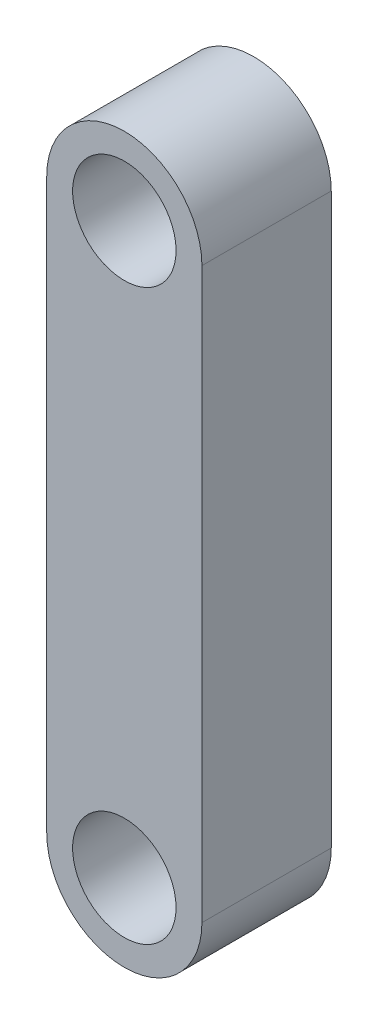
ISO-10303-21;
HEADER;
FILE_DESCRIPTION(('STEP AP214'),'2;1');
FILE_NAME('part.step','',(''),(''),'','','');
FILE_SCHEMA(('AUTOMOTIVE_DESIGN { 1 0 10303 214 1 1 1 1 }'));
ENDSEC;
DATA;
#1=APPLICATION_CONTEXT('core data for automotive mechanical design processes');
#2=APPLICATION_PROTOCOL_DEFINITION('international standard','automotive_design',2000,#1);
#3=PRODUCT_CONTEXT('',#1,'mechanical');
#4=PRODUCT('Part','Part','',(#3));
#5=PRODUCT_RELATED_PRODUCT_CATEGORY('part','',(#4));
#6=PRODUCT_DEFINITION_FORMATION('','',#4);
#7=PRODUCT_DEFINITION_CONTEXT('part definition',#1,'design');
#8=PRODUCT_DEFINITION('design','',#6,#7);
#9=PRODUCT_DEFINITION_SHAPE('','',#8);
#10=(LENGTH_UNIT() NAMED_UNIT(*) SI_UNIT(.MILLI.,.METRE.));
#11=(NAMED_UNIT(*) PLANE_ANGLE_UNIT() SI_UNIT($,.RADIAN.));
#12=(NAMED_UNIT(*) SI_UNIT($,.STERADIAN.) SOLID_ANGLE_UNIT());
#13=UNCERTAINTY_MEASURE_WITH_UNIT(LENGTH_MEASURE(1.E-05),#10,'distance_accuracy_value','');
#14=(GEOMETRIC_REPRESENTATION_CONTEXT(3) GLOBAL_UNCERTAINTY_ASSIGNED_CONTEXT((#13)) GLOBAL_UNIT_ASSIGNED_CONTEXT((#10,
#11,#12)) REPRESENTATION_CONTEXT('',''));
#15=CARTESIAN_POINT('',(0.,0.,0.));
#16=DIRECTION('',(0.,0.,1.));
#17=DIRECTION('',(1.,0.,0.));
#18=AXIS2_PLACEMENT_3D('',#15,#16,#17);
#19=CARTESIAN_POINT('',(1.76519337016574,17.0731215469613,5.));
#20=DIRECTION('',(0.,0.,-1.));
#21=DIRECTION('',(-1.,0.,0.));
#22=AXIS2_PLACEMENT_3D('',#19,#20,#21);
#23=PLANE('',#22);
#24=CARTESIAN_POINT('',(1.76519337016574,17.0731215469613,5.));
#25=DIRECTION('',(0.,0.,1.));
#26=DIRECTION('',(-1.,0.,0.));
#27=AXIS2_PLACEMENT_3D('',#24,#25,#26);
#28=CIRCLE('',#27,3.);
#29=CARTESIAN_POINT('',(4.76519337016574,17.0731215469613,5.));
#30=VERTEX_POINT('',#29);
#31=CARTESIAN_POINT('',(-1.23480662983426,17.0731215469613,5.));
#32=VERTEX_POINT('',#31);
#33=EDGE_CURVE('E85',#30,#32,#28,.T.);
#34=ORIENTED_EDGE('',*,*,#33,.T.);
#35=DIRECTION('',(0.,-1.,0.));
#36=VECTOR('',#35,1.);
#37=CARTESIAN_POINT('',(-1.23480662983426,17.0731215469613,5.));
#38=LINE('',#37,#36);
#39=CARTESIAN_POINT('',(-1.23480662983426,-4.92687845303868,5.));
#40=VERTEX_POINT('',#39);
#41=EDGE_CURVE('E80',#32,#40,#38,.T.);
#42=ORIENTED_EDGE('',*,*,#41,.T.);
#43=CARTESIAN_POINT('',(1.76519337016574,-4.92687845303867,5.));
#44=DIRECTION('',(0.,0.,1.));
#45=DIRECTION('',(1.,0.,0.));
#46=AXIS2_PLACEMENT_3D('',#43,#44,#45);
#47=CIRCLE('',#46,3.);
#48=CARTESIAN_POINT('',(4.76519337016574,-4.92687845303867,5.));
#49=VERTEX_POINT('',#48);
#50=EDGE_CURVE('E83',#40,#49,#47,.T.);
#51=ORIENTED_EDGE('',*,*,#50,.T.);
#52=DIRECTION('',(0.,1.,0.));
#53=VECTOR('',#52,1.);
#54=CARTESIAN_POINT('',(4.76519337016574,17.0731215469613,5.));
#55=LINE('',#54,#53);
#56=EDGE_CURVE('E50',#49,#30,#55,.T.);
#57=ORIENTED_EDGE('',*,*,#56,.T.);
#58=EDGE_LOOP('',(#34,#42,#51,#57));
#59=FACE_BOUND('',#58,.T.);
#60=CARTESIAN_POINT('',(1.76519337016574,17.0731215469613,5.));
#61=DIRECTION('',(0.,0.,1.));
#62=DIRECTION('',(1.,0.,0.));
#63=AXIS2_PLACEMENT_3D('',#60,#61,#62);
#64=CIRCLE('',#63,2.);
#65=CARTESIAN_POINT('',(3.76519337016574,17.0731215469613,5.));
#66=VERTEX_POINT('',#65);
#67=EDGE_CURVE('E100',#66,#66,#64,.T.);
#68=ORIENTED_EDGE('',*,*,#67,.F.);
#69=EDGE_LOOP('',(#68));
#70=FACE_BOUND('',#69,.T.);
#71=CARTESIAN_POINT('',(1.76519337016574,-4.92687845303867,5.));
#72=DIRECTION('',(0.,0.,1.));
#73=DIRECTION('',(1.,0.,0.));
#74=AXIS2_PLACEMENT_3D('',#71,#72,#73);
#75=CIRCLE('',#74,2.);
#76=CARTESIAN_POINT('',(3.76519337016574,-4.92687845303867,5.));
#77=VERTEX_POINT('',#76);
#78=EDGE_CURVE('E115',#77,#77,#75,.T.);
#79=ORIENTED_EDGE('',*,*,#78,.F.);
#80=EDGE_LOOP('',(#79));
#81=FACE_BOUND('',#80,.T.);
#82=ADVANCED_FACE('F33',(#59,#70,#81),#23,.F.);
#83=CARTESIAN_POINT('',(1.76519337016574,17.0731215469613,0.));
#84=DIRECTION('',(0.,0.,-1.));
#85=DIRECTION('',(-1.,0.,0.));
#86=AXIS2_PLACEMENT_3D('',#83,#84,#85);
#87=PLANE('',#86);
#88=CARTESIAN_POINT('',(1.76519337016574,17.0731215469613,0.));
#89=DIRECTION('',(0.,0.,1.));
#90=DIRECTION('',(1.,0.,0.));
#91=AXIS2_PLACEMENT_3D('',#88,#89,#90);
#92=CIRCLE('',#91,2.);
#93=CARTESIAN_POINT('',(3.76519337016574,17.0731215469613,0.));
#94=VERTEX_POINT('',#93);
#95=EDGE_CURVE('E112',#94,#94,#92,.T.);
#96=ORIENTED_EDGE('',*,*,#95,.T.);
#97=EDGE_LOOP('',(#96));
#98=FACE_BOUND('',#97,.T.);
#99=CARTESIAN_POINT('',(1.76519337016574,17.0731215469613,0.));
#100=DIRECTION('',(0.,0.,1.));
#101=DIRECTION('',(-1.,0.,0.));
#102=AXIS2_PLACEMENT_3D('',#99,#100,#101);
#103=CIRCLE('',#102,3.);
#104=CARTESIAN_POINT('',(4.76519337016574,17.0731215469613,0.));
#105=VERTEX_POINT('',#104);
#106=CARTESIAN_POINT('',(-1.23480662983426,17.0731215469613,0.));
#107=VERTEX_POINT('',#106);
#108=EDGE_CURVE('E97',#105,#107,#103,.T.);
#109=ORIENTED_EDGE('',*,*,#108,.F.);
#110=DIRECTION('',(0.,1.,0.));
#111=VECTOR('',#110,1.);
#112=CARTESIAN_POINT('',(4.76519337016574,17.0731215469613,0.));
#113=LINE('',#112,#111);
#114=CARTESIAN_POINT('',(4.76519337016574,-4.92687845303867,0.));
#115=VERTEX_POINT('',#114);
#116=EDGE_CURVE('E73',#115,#105,#113,.T.);
#117=ORIENTED_EDGE('',*,*,#116,.F.);
#118=CARTESIAN_POINT('',(1.76519337016574,-4.92687845303867,0.));
#119=DIRECTION('',(0.,0.,1.));
#120=DIRECTION('',(1.,0.,0.));
#121=AXIS2_PLACEMENT_3D('',#118,#119,#120);
#122=CIRCLE('',#121,3.);
#123=CARTESIAN_POINT('',(-1.23480662983426,-4.92687845303868,0.));
#124=VERTEX_POINT('',#123);
#125=EDGE_CURVE('E67',#124,#115,#122,.T.);
#126=ORIENTED_EDGE('',*,*,#125,.F.);
#127=DIRECTION('',(0.,-1.,0.));
#128=VECTOR('',#127,1.);
#129=CARTESIAN_POINT('',(-1.23480662983426,17.0731215469613,0.));
#130=LINE('',#129,#128);
#131=EDGE_CURVE('E89',#107,#124,#130,.T.);
#132=ORIENTED_EDGE('',*,*,#131,.F.);
#133=EDGE_LOOP('',(#109,#117,#126,#132));
#134=FACE_BOUND('',#133,.T.);
#135=CARTESIAN_POINT('',(1.76519337016574,-4.92687845303867,0.));
#136=DIRECTION('',(0.,0.,1.));
#137=DIRECTION('',(1.,0.,0.));
#138=AXIS2_PLACEMENT_3D('',#135,#136,#137);
#139=CIRCLE('',#138,2.);
#140=CARTESIAN_POINT('',(3.76519337016574,-4.92687845303867,0.));
#141=VERTEX_POINT('',#140);
#142=EDGE_CURVE('E118',#141,#141,#139,.T.);
#143=ORIENTED_EDGE('',*,*,#142,.T.);
#144=EDGE_LOOP('',(#143));
#145=FACE_BOUND('',#144,.T.);
#146=ADVANCED_FACE('F108',(#98,#134,#145),#87,.T.);
#147=CARTESIAN_POINT('',(1.76519337016574,17.0731215469613,5.));
#148=DIRECTION('',(0.,0.,-1.));
#149=DIRECTION('',(-1.,0.,0.));
#150=AXIS2_PLACEMENT_3D('',#147,#148,#149);
#151=CYLINDRICAL_SURFACE('',#150,3.);
#152=ORIENTED_EDGE('',*,*,#108,.T.);
#153=DIRECTION('',(0.,0.,-1.));
#154=VECTOR('',#153,1.);
#155=CARTESIAN_POINT('',(-1.23480662983426,17.0731215469613,5.));
#156=LINE('',#155,#154);
#157=EDGE_CURVE('E11',#32,#107,#156,.T.);
#158=ORIENTED_EDGE('',*,*,#157,.F.);
#159=ORIENTED_EDGE('',*,*,#33,.F.);
#160=DIRECTION('',(0.,0.,-1.));
#161=VECTOR('',#160,1.);
#162=CARTESIAN_POINT('',(4.76519337016574,17.0731215469613,5.));
#163=LINE('',#162,#161);
#164=EDGE_CURVE('E93',#30,#105,#163,.T.);
#165=ORIENTED_EDGE('',*,*,#164,.T.);
#166=EDGE_LOOP('',(#152,#158,#159,#165));
#167=FACE_BOUND('',#166,.T.);
#168=ADVANCED_FACE('F35',(#167),#151,.T.);
#169=CARTESIAN_POINT('',(-1.23480662983426,17.0731215469613,5.));
#170=DIRECTION('',(1.,0.,0.));
#171=DIRECTION('',(0.,1.,0.));
#172=AXIS2_PLACEMENT_3D('',#169,#170,#171);
#173=PLANE('',#172);
#174=ORIENTED_EDGE('',*,*,#131,.T.);
#175=DIRECTION('',(0.,0.,-1.));
#176=VECTOR('',#175,1.);
#177=CARTESIAN_POINT('',(-1.23480662983426,-4.92687845303868,5.));
#178=LINE('',#177,#176);
#179=EDGE_CURVE('E42',#40,#124,#178,.T.);
#180=ORIENTED_EDGE('',*,*,#179,.F.);
#181=ORIENTED_EDGE('',*,*,#41,.F.);
#182=ORIENTED_EDGE('',*,*,#157,.T.);
#183=EDGE_LOOP('',(#174,#180,#181,#182));
#184=FACE_BOUND('',#183,.T.);
#185=ADVANCED_FACE('F88',(#184),#173,.F.);
#186=CARTESIAN_POINT('',(1.76519337016574,-4.92687845303867,5.));
#187=DIRECTION('',(0.,0.,-1.));
#188=DIRECTION('',(-1.,0.,0.));
#189=AXIS2_PLACEMENT_3D('',#186,#187,#188);
#190=CYLINDRICAL_SURFACE('',#189,3.);
#191=ORIENTED_EDGE('',*,*,#125,.T.);
#192=DIRECTION('',(0.,0.,-1.));
#193=VECTOR('',#192,1.);
#194=CARTESIAN_POINT('',(4.76519337016574,-4.92687845303867,5.));
#195=LINE('',#194,#193);
#196=EDGE_CURVE('E90',#49,#115,#195,.T.);
#197=ORIENTED_EDGE('',*,*,#196,.F.);
#198=ORIENTED_EDGE('',*,*,#50,.F.);
#199=ORIENTED_EDGE('',*,*,#179,.T.);
#200=EDGE_LOOP('',(#191,#197,#198,#199));
#201=FACE_BOUND('',#200,.T.);
#202=ADVANCED_FACE('F91',(#201),#190,.T.);
#203=CARTESIAN_POINT('',(4.76519337016574,17.0731215469613,5.));
#204=DIRECTION('',(-1.,0.,0.));
#205=DIRECTION('',(0.,-1.,0.));
#206=AXIS2_PLACEMENT_3D('',#203,#204,#205);
#207=PLANE('',#206);
#208=ORIENTED_EDGE('',*,*,#116,.T.);
#209=ORIENTED_EDGE('',*,*,#164,.F.);
#210=ORIENTED_EDGE('',*,*,#56,.F.);
#211=ORIENTED_EDGE('',*,*,#196,.T.);
#212=EDGE_LOOP('',(#208,#209,#210,#211));
#213=FACE_BOUND('',#212,.T.);
#214=ADVANCED_FACE('F105',(#213),#207,.F.);
#215=CARTESIAN_POINT('',(1.76519337016574,17.0731215469613,5.));
#216=DIRECTION('',(0.,0.,-1.));
#217=DIRECTION('',(-1.,0.,0.));
#218=AXIS2_PLACEMENT_3D('',#215,#216,#217);
#219=CYLINDRICAL_SURFACE('',#218,2.);
#220=ORIENTED_EDGE('',*,*,#67,.T.);
#221=EDGE_LOOP('',(#220));
#222=FACE_BOUND('',#221,.T.);
#223=ORIENTED_EDGE('',*,*,#95,.F.);
#224=EDGE_LOOP('',(#223));
#225=FACE_BOUND('',#224,.T.);
#226=ADVANCED_FACE('F135',(#222,#225),#219,.F.);
#227=CARTESIAN_POINT('',(1.76519337016574,-4.92687845303867,5.));
#228=DIRECTION('',(0.,0.,-1.));
#229=DIRECTION('',(-1.,0.,0.));
#230=AXIS2_PLACEMENT_3D('',#227,#228,#229);
#231=CYLINDRICAL_SURFACE('',#230,2.);
#232=ORIENTED_EDGE('',*,*,#78,.T.);
#233=EDGE_LOOP('',(#232));
#234=FACE_BOUND('',#233,.T.);
#235=ORIENTED_EDGE('',*,*,#142,.F.);
#236=EDGE_LOOP('',(#235));
#237=FACE_BOUND('',#236,.T.);
#238=ADVANCED_FACE('F124',(#234,#237),#231,.F.);
#239=CLOSED_SHELL('',(#82,#146,#168,#185,#202,#214,#226,#238));
#240=MANIFOLD_SOLID_BREP('B2',#239);
#241=ADVANCED_BREP_SHAPE_REPRESENTATION('',(#18,#240),#14);
#242=SHAPE_DEFINITION_REPRESENTATION(#9,#241);
ENDSEC;
END-ISO-10303-21;
